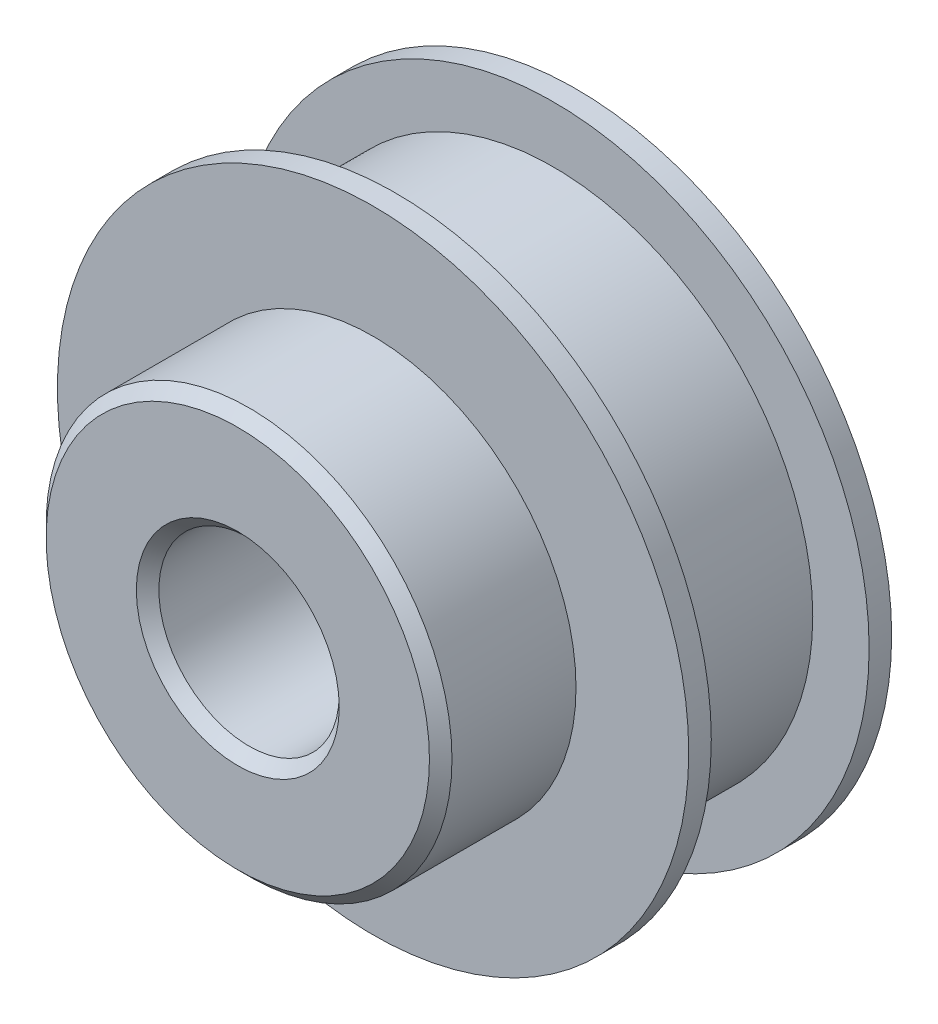
ISO-10303-21;
HEADER;
FILE_DESCRIPTION(('STEP AP214'),'2;1');
FILE_NAME('part.step','',(''),(''),'','','');
FILE_SCHEMA(('AUTOMOTIVE_DESIGN { 1 0 10303 214 1 1 1 1 }'));
ENDSEC;
DATA;
#1=APPLICATION_CONTEXT('core data for automotive mechanical design processes');
#2=APPLICATION_PROTOCOL_DEFINITION('international standard','automotive_design',2000,#1);
#3=PRODUCT_CONTEXT('',#1,'mechanical');
#4=PRODUCT('Part','Part','',(#3));
#5=PRODUCT_RELATED_PRODUCT_CATEGORY('part','',(#4));
#6=PRODUCT_DEFINITION_FORMATION('','',#4);
#7=PRODUCT_DEFINITION_CONTEXT('part definition',#1,'design');
#8=PRODUCT_DEFINITION('design','',#6,#7);
#9=PRODUCT_DEFINITION_SHAPE('','',#8);
#10=(LENGTH_UNIT() NAMED_UNIT(*) SI_UNIT(.MILLI.,.METRE.));
#11=(NAMED_UNIT(*) PLANE_ANGLE_UNIT() SI_UNIT($,.RADIAN.));
#12=(NAMED_UNIT(*) SI_UNIT($,.STERADIAN.) SOLID_ANGLE_UNIT());
#13=UNCERTAINTY_MEASURE_WITH_UNIT(LENGTH_MEASURE(1.E-05),#10,'distance_accuracy_value','');
#14=(GEOMETRIC_REPRESENTATION_CONTEXT(3) GLOBAL_UNCERTAINTY_ASSIGNED_CONTEXT((#13)) GLOBAL_UNIT_ASSIGNED_CONTEXT((#10,
#11,#12)) REPRESENTATION_CONTEXT('',''));
#15=CARTESIAN_POINT('',(0.,0.,0.));
#16=DIRECTION('',(0.,0.,1.));
#17=DIRECTION('',(1.,0.,0.));
#18=AXIS2_PLACEMENT_3D('',#15,#16,#17);
#19=CARTESIAN_POINT('',(0.,0.,1.));
#20=DIRECTION('',(0.,0.,-1.));
#21=DIRECTION('',(-1.,0.,0.));
#22=AXIS2_PLACEMENT_3D('',#19,#20,#21);
#23=CYLINDRICAL_SURFACE('',#22,14.);
#24=CARTESIAN_POINT('',(0.,0.,1.));
#25=DIRECTION('',(0.,0.,1.));
#26=DIRECTION('',(1.,0.,0.));
#27=AXIS2_PLACEMENT_3D('',#24,#25,#26);
#28=CIRCLE('',#27,14.);
#29=CARTESIAN_POINT('',(14.,0.,1.));
#30=VERTEX_POINT('',#29);
#31=EDGE_CURVE('E57',#30,#30,#28,.T.);
#32=ORIENTED_EDGE('',*,*,#31,.F.);
#33=EDGE_LOOP('',(#32));
#34=FACE_BOUND('',#33,.T.);
#35=CARTESIAN_POINT('',(0.,0.,0.));
#36=DIRECTION('',(0.,0.,1.));
#37=DIRECTION('',(1.,0.,0.));
#38=AXIS2_PLACEMENT_3D('',#35,#36,#37);
#39=CIRCLE('',#38,14.);
#40=CARTESIAN_POINT('',(14.,0.,0.));
#41=VERTEX_POINT('',#40);
#42=EDGE_CURVE('E58',#41,#41,#39,.T.);
#43=ORIENTED_EDGE('',*,*,#42,.T.);
#44=EDGE_LOOP('',(#43));
#45=FACE_BOUND('',#44,.T.);
#46=ADVANCED_FACE('F31',(#34,#45),#23,.T.);
#47=CARTESIAN_POINT('',(0.,0.,1.));
#48=DIRECTION('',(0.,0.,1.));
#49=DIRECTION('',(1.,0.,0.));
#50=AXIS2_PLACEMENT_3D('',#47,#48,#49);
#51=PLANE('',#50);
#52=CARTESIAN_POINT('',(0.,0.,1.));
#53=DIRECTION('',(0.,0.,1.));
#54=DIRECTION('',(1.,0.,0.));
#55=AXIS2_PLACEMENT_3D('',#52,#53,#54);
#56=CIRCLE('',#55,11.5);
#57=CARTESIAN_POINT('',(11.5,0.,1.));
#58=VERTEX_POINT('',#57);
#59=EDGE_CURVE('E64',#58,#58,#56,.T.);
#60=ORIENTED_EDGE('',*,*,#59,.F.);
#61=EDGE_LOOP('',(#60));
#62=FACE_BOUND('',#61,.T.);
#63=ORIENTED_EDGE('',*,*,#31,.T.);
#64=EDGE_LOOP('',(#63));
#65=FACE_BOUND('',#64,.T.);
#66=ADVANCED_FACE('F105',(#62,#65),#51,.T.);
#67=CARTESIAN_POINT('',(0.,0.,0.));
#68=DIRECTION('',(0.,0.,1.));
#69=DIRECTION('',(1.,0.,0.));
#70=AXIS2_PLACEMENT_3D('',#67,#68,#69);
#71=PLANE('',#70);
#72=CARTESIAN_POINT('',(0.,0.,0.));
#73=DIRECTION('',(0.,0.,1.));
#74=DIRECTION('',(1.,0.,0.));
#75=AXIS2_PLACEMENT_3D('',#72,#73,#74);
#76=CIRCLE('',#75,4.5);
#77=CARTESIAN_POINT('',(4.5,0.,0.));
#78=VERTEX_POINT('',#77);
#79=EDGE_CURVE('E10',#78,#78,#76,.T.);
#80=ORIENTED_EDGE('',*,*,#79,.T.);
#81=EDGE_LOOP('',(#80));
#82=FACE_BOUND('',#81,.T.);
#83=ORIENTED_EDGE('',*,*,#42,.F.);
#84=EDGE_LOOP('',(#83));
#85=FACE_BOUND('',#84,.T.);
#86=ADVANCED_FACE('F111',(#82,#85),#71,.F.);
#87=CARTESIAN_POINT('',(0.,0.,8.));
#88=DIRECTION('',(0.,0.,-1.));
#89=DIRECTION('',(-1.,0.,0.));
#90=AXIS2_PLACEMENT_3D('',#87,#88,#89);
#91=CYLINDRICAL_SURFACE('',#90,11.5);
#92=CARTESIAN_POINT('',(0.,0.,8.));
#93=DIRECTION('',(0.,0.,1.));
#94=DIRECTION('',(1.,0.,0.));
#95=AXIS2_PLACEMENT_3D('',#92,#93,#94);
#96=CIRCLE('',#95,11.5);
#97=CARTESIAN_POINT('',(11.5,0.,8.));
#98=VERTEX_POINT('',#97);
#99=EDGE_CURVE('E61',#98,#98,#96,.T.);
#100=ORIENTED_EDGE('',*,*,#99,.F.);
#101=EDGE_LOOP('',(#100));
#102=FACE_BOUND('',#101,.T.);
#103=ORIENTED_EDGE('',*,*,#59,.T.);
#104=EDGE_LOOP('',(#103));
#105=FACE_BOUND('',#104,.T.);
#106=ADVANCED_FACE('F91',(#102,#105),#91,.T.);
#107=CARTESIAN_POINT('',(0.,0.,9.));
#108=DIRECTION('',(0.,0.,-1.));
#109=DIRECTION('',(-1.,0.,0.));
#110=AXIS2_PLACEMENT_3D('',#107,#108,#109);
#111=CYLINDRICAL_SURFACE('',#110,14.);
#112=CARTESIAN_POINT('',(0.,0.,9.));
#113=DIRECTION('',(0.,0.,1.));
#114=DIRECTION('',(1.,0.,0.));
#115=AXIS2_PLACEMENT_3D('',#112,#113,#114);
#116=CIRCLE('',#115,14.);
#117=CARTESIAN_POINT('',(14.,0.,9.));
#118=VERTEX_POINT('',#117);
#119=EDGE_CURVE('E67',#118,#118,#116,.T.);
#120=ORIENTED_EDGE('',*,*,#119,.F.);
#121=EDGE_LOOP('',(#120));
#122=FACE_BOUND('',#121,.T.);
#123=CARTESIAN_POINT('',(0.,0.,8.));
#124=DIRECTION('',(0.,0.,1.));
#125=DIRECTION('',(1.,0.,0.));
#126=AXIS2_PLACEMENT_3D('',#123,#124,#125);
#127=CIRCLE('',#126,14.);
#128=CARTESIAN_POINT('',(14.,0.,8.));
#129=VERTEX_POINT('',#128);
#130=EDGE_CURVE('E70',#129,#129,#127,.T.);
#131=ORIENTED_EDGE('',*,*,#130,.T.);
#132=EDGE_LOOP('',(#131));
#133=FACE_BOUND('',#132,.T.);
#134=ADVANCED_FACE('F85',(#122,#133),#111,.T.);
#135=CARTESIAN_POINT('',(0.,0.,9.));
#136=DIRECTION('',(0.,0.,1.));
#137=DIRECTION('',(1.,0.,0.));
#138=AXIS2_PLACEMENT_3D('',#135,#136,#137);
#139=PLANE('',#138);
#140=CARTESIAN_POINT('',(0.,0.,9.));
#141=DIRECTION('',(0.,0.,1.));
#142=DIRECTION('',(1.,0.,0.));
#143=AXIS2_PLACEMENT_3D('',#140,#141,#142);
#144=CIRCLE('',#143,9.);
#145=CARTESIAN_POINT('',(9.,0.,9.));
#146=VERTEX_POINT('',#145);
#147=EDGE_CURVE('E73',#146,#146,#144,.T.);
#148=ORIENTED_EDGE('',*,*,#147,.F.);
#149=EDGE_LOOP('',(#148));
#150=FACE_BOUND('',#149,.T.);
#151=ORIENTED_EDGE('',*,*,#119,.T.);
#152=EDGE_LOOP('',(#151));
#153=FACE_BOUND('',#152,.T.);
#154=ADVANCED_FACE('F81',(#150,#153),#139,.T.);
#155=CARTESIAN_POINT('',(0.,0.,8.));
#156=DIRECTION('',(0.,0.,1.));
#157=DIRECTION('',(1.,0.,0.));
#158=AXIS2_PLACEMENT_3D('',#155,#156,#157);
#159=PLANE('',#158);
#160=ORIENTED_EDGE('',*,*,#99,.T.);
#161=EDGE_LOOP('',(#160));
#162=FACE_BOUND('',#161,.T.);
#163=ORIENTED_EDGE('',*,*,#130,.F.);
#164=EDGE_LOOP('',(#163));
#165=FACE_BOUND('',#164,.T.);
#166=ADVANCED_FACE('F84',(#162,#165),#159,.F.);
#167=CARTESIAN_POINT('',(0.,0.,15.));
#168=DIRECTION('',(0.,0.,-1.));
#169=DIRECTION('',(-1.,0.,0.));
#170=AXIS2_PLACEMENT_3D('',#167,#168,#169);
#171=CYLINDRICAL_SURFACE('',#170,9.);
#172=CARTESIAN_POINT('',(0.,0.,14.5));
#173=DIRECTION('',(0.,0.,1.));
#174=DIRECTION('',(1.,0.,0.));
#175=AXIS2_PLACEMENT_3D('',#172,#173,#174);
#176=CIRCLE('',#175,9.);
#177=CARTESIAN_POINT('',(9.,0.,14.5));
#178=VERTEX_POINT('',#177);
#179=EDGE_CURVE('E46',#178,#178,#176,.F.);
#180=ORIENTED_EDGE('',*,*,#179,.T.);
#181=EDGE_LOOP('',(#180));
#182=FACE_BOUND('',#181,.T.);
#183=ORIENTED_EDGE('',*,*,#147,.T.);
#184=EDGE_LOOP('',(#183));
#185=FACE_BOUND('',#184,.T.);
#186=ADVANCED_FACE('F79',(#182,#185),#171,.T.);
#187=CARTESIAN_POINT('',(0.,0.,15.));
#188=DIRECTION('',(0.,0.,1.));
#189=DIRECTION('',(1.,0.,0.));
#190=AXIS2_PLACEMENT_3D('',#187,#188,#189);
#191=PLANE('',#190);
#192=CARTESIAN_POINT('',(0.,0.,15.));
#193=DIRECTION('',(0.,0.,1.));
#194=DIRECTION('',(1.,0.,0.));
#195=AXIS2_PLACEMENT_3D('',#192,#193,#194);
#196=CIRCLE('',#195,8.5);
#197=CARTESIAN_POINT('',(8.5,0.,15.));
#198=VERTEX_POINT('',#197);
#199=EDGE_CURVE('E51',#198,#198,#196,.T.);
#200=ORIENTED_EDGE('',*,*,#199,.T.);
#201=EDGE_LOOP('',(#200));
#202=FACE_BOUND('',#201,.T.);
#203=CARTESIAN_POINT('',(0.,0.,15.));
#204=DIRECTION('',(0.,0.,1.));
#205=DIRECTION('',(1.,0.,0.));
#206=AXIS2_PLACEMENT_3D('',#203,#204,#205);
#207=CIRCLE('',#206,4.5);
#208=CARTESIAN_POINT('',(4.5,0.,15.));
#209=VERTEX_POINT('',#208);
#210=EDGE_CURVE('E54',#209,#209,#207,.F.);
#211=ORIENTED_EDGE('',*,*,#210,.T.);
#212=EDGE_LOOP('',(#211));
#213=FACE_BOUND('',#212,.T.);
#214=ADVANCED_FACE('F101',(#202,#213),#191,.T.);
#215=CARTESIAN_POINT('',(0.,0.,23.));
#216=DIRECTION('',(0.,0.,-1.));
#217=DIRECTION('',(-1.,0.,0.));
#218=AXIS2_PLACEMENT_3D('',#215,#216,#217);
#219=CYLINDRICAL_SURFACE('',#218,4.);
#220=CARTESIAN_POINT('',(0.,0.,14.5));
#221=DIRECTION('',(0.,0.,1.));
#222=DIRECTION('',(1.,0.,0.));
#223=AXIS2_PLACEMENT_3D('',#220,#221,#222);
#224=CIRCLE('',#223,4.);
#225=CARTESIAN_POINT('',(4.,0.,14.5));
#226=VERTEX_POINT('',#225);
#227=EDGE_CURVE('E38',#226,#226,#224,.T.);
#228=ORIENTED_EDGE('',*,*,#227,.T.);
#229=EDGE_LOOP('',(#228));
#230=FACE_BOUND('',#229,.T.);
#231=CARTESIAN_POINT('',(0.,0.,0.500000000000004));
#232=DIRECTION('',(0.,0.,1.));
#233=DIRECTION('',(1.,0.,0.));
#234=AXIS2_PLACEMENT_3D('',#231,#232,#233);
#235=CIRCLE('',#234,4.);
#236=CARTESIAN_POINT('',(4.,0.,0.500000000000004));
#237=VERTEX_POINT('',#236);
#238=EDGE_CURVE('E42',#237,#237,#235,.F.);
#239=ORIENTED_EDGE('',*,*,#238,.T.);
#240=EDGE_LOOP('',(#239));
#241=FACE_BOUND('',#240,.T.);
#242=ADVANCED_FACE('F121',(#230,#241),#219,.F.);
#243=CARTESIAN_POINT('',(0.,0.,15.));
#244=DIRECTION('',(0.,0.,-1.));
#245=DIRECTION('',(-1.,0.,0.));
#246=AXIS2_PLACEMENT_3D('',#243,#244,#245);
#247=CONICAL_SURFACE('',#246,8.5,0.785398163397447);
#248=ORIENTED_EDGE('',*,*,#179,.F.);
#249=EDGE_LOOP('',(#248));
#250=FACE_BOUND('',#249,.T.);
#251=ORIENTED_EDGE('',*,*,#199,.F.);
#252=EDGE_LOOP('',(#251));
#253=FACE_BOUND('',#252,.T.);
#254=ADVANCED_FACE('F118',(#250,#253),#247,.T.);
#255=CARTESIAN_POINT('',(0.,0.,14.5));
#256=DIRECTION('',(0.,0.,1.));
#257=DIRECTION('',(1.,0.,0.));
#258=AXIS2_PLACEMENT_3D('',#255,#256,#257);
#259=CONICAL_SURFACE('',#258,4.,0.785398163397448);
#260=ORIENTED_EDGE('',*,*,#210,.F.);
#261=EDGE_LOOP('',(#260));
#262=FACE_BOUND('',#261,.T.);
#263=ORIENTED_EDGE('',*,*,#227,.F.);
#264=EDGE_LOOP('',(#263));
#265=FACE_BOUND('',#264,.T.);
#266=ADVANCED_FACE('F120',(#262,#265),#259,.F.);
#267=CARTESIAN_POINT('',(0.,0.,0.500000000000004));
#268=DIRECTION('',(0.,0.,-1.));
#269=DIRECTION('',(-1.,0.,0.));
#270=AXIS2_PLACEMENT_3D('',#267,#268,#269);
#271=CONICAL_SURFACE('',#270,4.,0.785398163397448);
#272=ORIENTED_EDGE('',*,*,#79,.F.);
#273=EDGE_LOOP('',(#272));
#274=FACE_BOUND('',#273,.T.);
#275=ORIENTED_EDGE('',*,*,#238,.F.);
#276=EDGE_LOOP('',(#275));
#277=FACE_BOUND('',#276,.T.);
#278=ADVANCED_FACE('F33',(#274,#277),#271,.F.);
#279=CLOSED_SHELL('',(#46,#66,#86,#106,#134,#154,#166,#186,#214,#242,#254,#266,#278));
#280=MANIFOLD_SOLID_BREP('B2',#279);
#281=ADVANCED_BREP_SHAPE_REPRESENTATION('',(#18,#280),#14);
#282=SHAPE_DEFINITION_REPRESENTATION(#9,#281);
ENDSEC;
END-ISO-10303-21;
